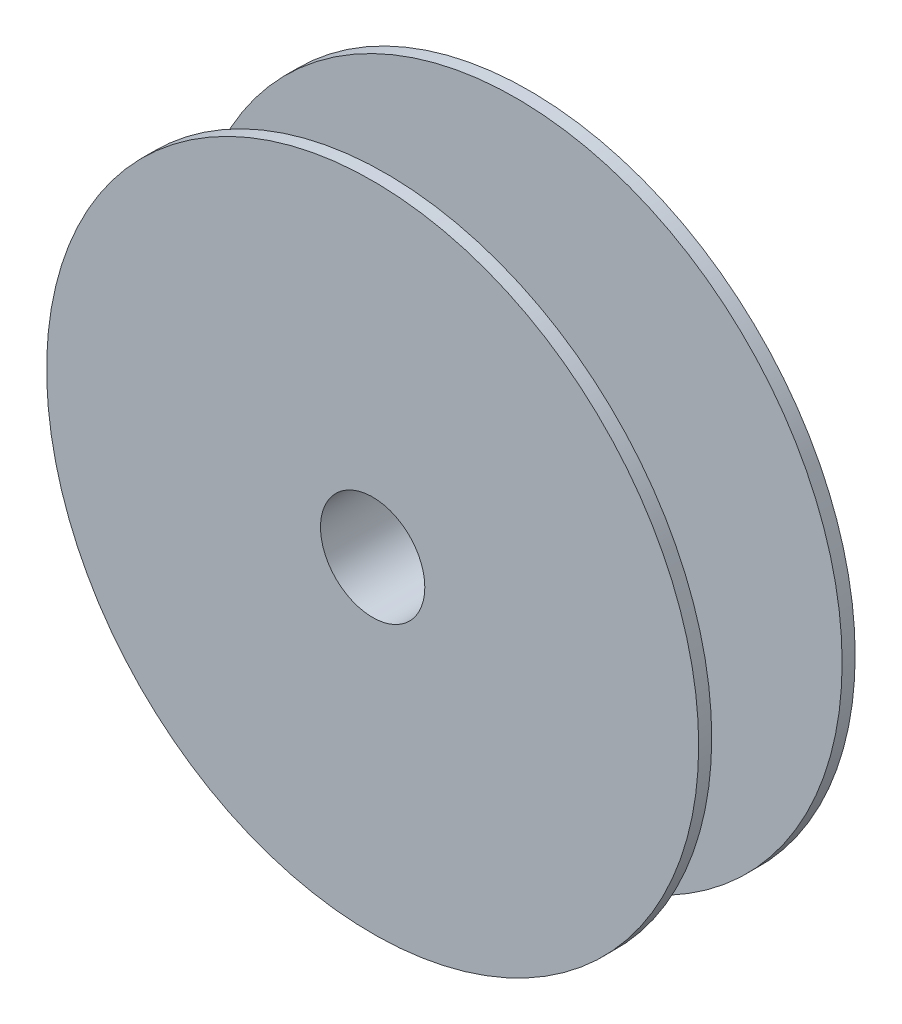
ISO-10303-21;
HEADER;
FILE_DESCRIPTION(('STEP AP214'),'2;1');
FILE_NAME('part.step','',(''),(''),'','','');
FILE_SCHEMA(('AUTOMOTIVE_DESIGN { 1 0 10303 214 1 1 1 1 }'));
ENDSEC;
DATA;
#1=APPLICATION_CONTEXT('core data for automotive mechanical design processes');
#2=APPLICATION_PROTOCOL_DEFINITION('international standard','automotive_design',2000,#1);
#3=PRODUCT_CONTEXT('',#1,'mechanical');
#4=PRODUCT('Part','Part','',(#3));
#5=PRODUCT_RELATED_PRODUCT_CATEGORY('part','',(#4));
#6=PRODUCT_DEFINITION_FORMATION('','',#4);
#7=PRODUCT_DEFINITION_CONTEXT('part definition',#1,'design');
#8=PRODUCT_DEFINITION('design','',#6,#7);
#9=PRODUCT_DEFINITION_SHAPE('','',#8);
#10=(LENGTH_UNIT() NAMED_UNIT(*) SI_UNIT(.MILLI.,.METRE.));
#11=(NAMED_UNIT(*) PLANE_ANGLE_UNIT() SI_UNIT($,.RADIAN.));
#12=(NAMED_UNIT(*) SI_UNIT($,.STERADIAN.) SOLID_ANGLE_UNIT());
#13=UNCERTAINTY_MEASURE_WITH_UNIT(LENGTH_MEASURE(1.E-05),#10,'distance_accuracy_value','');
#14=(GEOMETRIC_REPRESENTATION_CONTEXT(3) GLOBAL_UNCERTAINTY_ASSIGNED_CONTEXT((#13)) GLOBAL_UNIT_ASSIGNED_CONTEXT((#10,
#11,#12)) REPRESENTATION_CONTEXT('',''));
#15=CARTESIAN_POINT('',(0.,0.,0.));
#16=DIRECTION('',(0.,0.,1.));
#17=DIRECTION('',(1.,0.,0.));
#18=AXIS2_PLACEMENT_3D('',#15,#16,#17);
#19=CARTESIAN_POINT('',(0.,0.,60.));
#20=DIRECTION('',(0.,0.,-1.));
#21=DIRECTION('',(-1.,0.,0.));
#22=AXIS2_PLACEMENT_3D('',#19,#20,#21);
#23=CYLINDRICAL_SURFACE('',#22,125.);
#24=CARTESIAN_POINT('',(0.,0.,0.));
#25=DIRECTION('',(0.,0.,1.));
#26=DIRECTION('',(1.,0.,0.));
#27=AXIS2_PLACEMENT_3D('',#24,#25,#26);
#28=CIRCLE('',#27,125.);
#29=CARTESIAN_POINT('',(125.,0.,0.));
#30=VERTEX_POINT('',#29);
#31=EDGE_CURVE('E34',#30,#30,#28,.T.);
#32=ORIENTED_EDGE('',*,*,#31,.T.);
#33=EDGE_LOOP('',(#32));
#34=FACE_BOUND('',#33,.T.);
#35=CARTESIAN_POINT('',(0.,0.,5.));
#36=DIRECTION('',(0.,0.,1.));
#37=DIRECTION('',(1.,0.,0.));
#38=AXIS2_PLACEMENT_3D('',#35,#36,#37);
#39=CIRCLE('',#38,125.);
#40=CARTESIAN_POINT('',(125.,0.,5.));
#41=VERTEX_POINT('',#40);
#42=EDGE_CURVE('E49',#41,#41,#39,.T.);
#43=ORIENTED_EDGE('',*,*,#42,.F.);
#44=EDGE_LOOP('',(#43));
#45=FACE_BOUND('',#44,.T.);
#46=ADVANCED_FACE('F30',(#34,#45),#23,.T.);
#47=CARTESIAN_POINT('',(0.,0.,60.));
#48=DIRECTION('',(0.,0.,1.));
#49=DIRECTION('',(1.,0.,0.));
#50=AXIS2_PLACEMENT_3D('',#47,#48,#49);
#51=PLANE('',#50);
#52=CARTESIAN_POINT('',(0.,0.,60.));
#53=DIRECTION('',(0.,0.,1.));
#54=DIRECTION('',(1.,0.,0.));
#55=AXIS2_PLACEMENT_3D('',#52,#53,#54);
#56=CIRCLE('',#55,125.);
#57=CARTESIAN_POINT('',(125.,0.,60.));
#58=VERTEX_POINT('',#57);
#59=EDGE_CURVE('E10',#58,#58,#56,.T.);
#60=ORIENTED_EDGE('',*,*,#59,.T.);
#61=EDGE_LOOP('',(#60));
#62=FACE_BOUND('',#61,.T.);
#63=CARTESIAN_POINT('',(0.,0.,60.));
#64=DIRECTION('',(0.,0.,1.));
#65=DIRECTION('',(1.,0.,0.));
#66=AXIS2_PLACEMENT_3D('',#63,#64,#65);
#67=CIRCLE('',#66,20.);
#68=CARTESIAN_POINT('',(20.,0.,60.));
#69=VERTEX_POINT('',#68);
#70=EDGE_CURVE('E41',#69,#69,#67,.T.);
#71=ORIENTED_EDGE('',*,*,#70,.F.);
#72=EDGE_LOOP('',(#71));
#73=FACE_BOUND('',#72,.T.);
#74=ADVANCED_FACE('F80',(#62,#73),#51,.T.);
#75=CARTESIAN_POINT('',(0.,0.,0.));
#76=DIRECTION('',(0.,0.,1.));
#77=DIRECTION('',(1.,0.,0.));
#78=AXIS2_PLACEMENT_3D('',#75,#76,#77);
#79=PLANE('',#78);
#80=ORIENTED_EDGE('',*,*,#31,.F.);
#81=EDGE_LOOP('',(#80));
#82=FACE_BOUND('',#81,.T.);
#83=CARTESIAN_POINT('',(0.,0.,0.));
#84=DIRECTION('',(0.,0.,1.));
#85=DIRECTION('',(1.,0.,0.));
#86=AXIS2_PLACEMENT_3D('',#83,#84,#85);
#87=CIRCLE('',#86,20.);
#88=CARTESIAN_POINT('',(20.,0.,0.));
#89=VERTEX_POINT('',#88);
#90=EDGE_CURVE('E43',#89,#89,#87,.T.);
#91=ORIENTED_EDGE('',*,*,#90,.T.);
#92=EDGE_LOOP('',(#91));
#93=FACE_BOUND('',#92,.T.);
#94=ADVANCED_FACE('F85',(#82,#93),#79,.F.);
#95=CARTESIAN_POINT('',(0.,0.,55.));
#96=DIRECTION('',(0.,0.,1.));
#97=DIRECTION('',(1.,0.,0.));
#98=AXIS2_PLACEMENT_3D('',#95,#96,#97);
#99=CIRCLE('',#98,125.);
#100=CARTESIAN_POINT('',(125.,0.,55.));
#101=VERTEX_POINT('',#100);
#102=EDGE_CURVE('E46',#101,#101,#99,.T.);
#103=ORIENTED_EDGE('',*,*,#102,.T.);
#104=EDGE_LOOP('',(#103));
#105=FACE_BOUND('',#104,.T.);
#106=ORIENTED_EDGE('',*,*,#59,.F.);
#107=EDGE_LOOP('',(#106));
#108=FACE_BOUND('',#107,.T.);
#109=ADVANCED_FACE('F32',(#105,#108),#23,.T.);
#110=CARTESIAN_POINT('',(0.,0.,60.));
#111=DIRECTION('',(0.,0.,-1.));
#112=DIRECTION('',(-1.,0.,0.));
#113=AXIS2_PLACEMENT_3D('',#110,#111,#112);
#114=CYLINDRICAL_SURFACE('',#113,20.);
#115=ORIENTED_EDGE('',*,*,#70,.T.);
#116=EDGE_LOOP('',(#115));
#117=FACE_BOUND('',#116,.T.);
#118=ORIENTED_EDGE('',*,*,#90,.F.);
#119=EDGE_LOOP('',(#118));
#120=FACE_BOUND('',#119,.T.);
#121=ADVANCED_FACE('F76',(#117,#120),#114,.F.);
#122=CARTESIAN_POINT('',(0.,0.,55.));
#123=DIRECTION('',(0.,0.,1.));
#124=DIRECTION('',(1.,0.,0.));
#125=AXIS2_PLACEMENT_3D('',#122,#123,#124);
#126=PLANE('',#125);
#127=ORIENTED_EDGE('',*,*,#102,.F.);
#128=EDGE_LOOP('',(#127));
#129=FACE_BOUND('',#128,.T.);
#130=CARTESIAN_POINT('',(0.,0.,55.));
#131=DIRECTION('',(0.,0.,1.));
#132=DIRECTION('',(1.,0.,0.));
#133=AXIS2_PLACEMENT_3D('',#130,#131,#132);
#134=CIRCLE('',#133,25.);
#135=CARTESIAN_POINT('',(25.,0.,55.));
#136=VERTEX_POINT('',#135);
#137=EDGE_CURVE('E52',#136,#136,#134,.T.);
#138=ORIENTED_EDGE('',*,*,#137,.T.);
#139=EDGE_LOOP('',(#138));
#140=FACE_BOUND('',#139,.T.);
#141=ADVANCED_FACE('F61',(#129,#140),#126,.F.);
#142=CARTESIAN_POINT('',(0.,0.,5.));
#143=DIRECTION('',(0.,0.,1.));
#144=DIRECTION('',(1.,0.,0.));
#145=AXIS2_PLACEMENT_3D('',#142,#143,#144);
#146=PLANE('',#145);
#147=ORIENTED_EDGE('',*,*,#42,.T.);
#148=EDGE_LOOP('',(#147));
#149=FACE_BOUND('',#148,.T.);
#150=CARTESIAN_POINT('',(0.,0.,5.));
#151=DIRECTION('',(0.,0.,1.));
#152=DIRECTION('',(1.,0.,0.));
#153=AXIS2_PLACEMENT_3D('',#150,#151,#152);
#154=CIRCLE('',#153,25.);
#155=CARTESIAN_POINT('',(25.,0.,5.));
#156=VERTEX_POINT('',#155);
#157=EDGE_CURVE('E55',#156,#156,#154,.T.);
#158=ORIENTED_EDGE('',*,*,#157,.F.);
#159=EDGE_LOOP('',(#158));
#160=FACE_BOUND('',#159,.T.);
#161=ADVANCED_FACE('F66',(#149,#160),#146,.T.);
#162=CARTESIAN_POINT('',(0.,0.,60.));
#163=DIRECTION('',(0.,0.,-1.));
#164=DIRECTION('',(-1.,0.,0.));
#165=AXIS2_PLACEMENT_3D('',#162,#163,#164);
#166=CYLINDRICAL_SURFACE('',#165,25.);
#167=ORIENTED_EDGE('',*,*,#137,.F.);
#168=EDGE_LOOP('',(#167));
#169=FACE_BOUND('',#168,.T.);
#170=ORIENTED_EDGE('',*,*,#157,.T.);
#171=EDGE_LOOP('',(#170));
#172=FACE_BOUND('',#171,.T.);
#173=ADVANCED_FACE('F63',(#169,#172),#166,.T.);
#174=CLOSED_SHELL('',(#46,#74,#94,#109,#121,#141,#161,#173));
#175=MANIFOLD_SOLID_BREP('B2',#174);
#176=ADVANCED_BREP_SHAPE_REPRESENTATION('',(#18,#175),#14);
#177=SHAPE_DEFINITION_REPRESENTATION(#9,#176);
ENDSEC;
END-ISO-10303-21;
